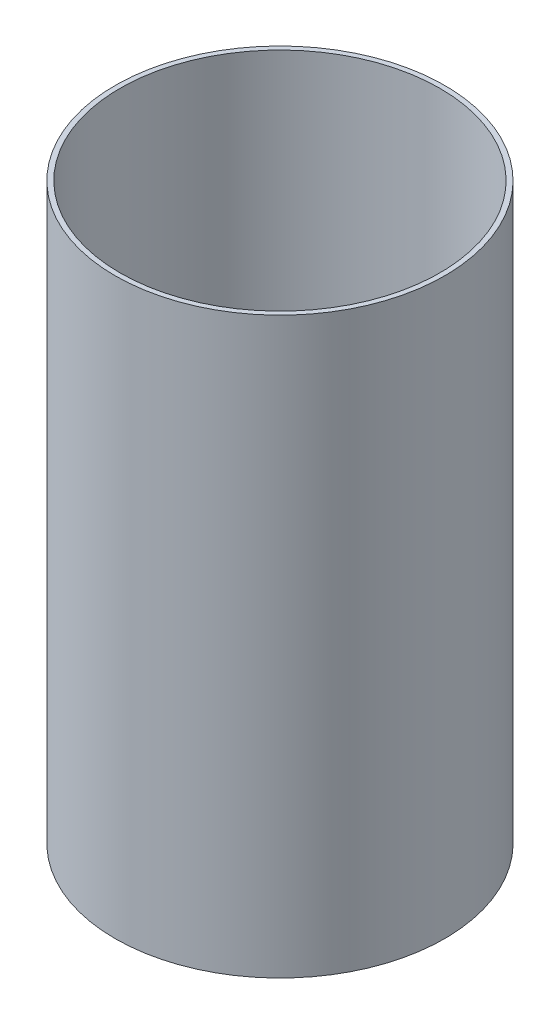
ISO-10303-21;
HEADER;
FILE_DESCRIPTION(('STEP AP214'),'2;1');
FILE_NAME('part.step','',(''),(''),'','','');
FILE_SCHEMA(('AUTOMOTIVE_DESIGN { 1 0 10303 214 1 1 1 1 }'));
ENDSEC;
DATA;
#1=APPLICATION_CONTEXT('core data for automotive mechanical design processes');
#2=APPLICATION_PROTOCOL_DEFINITION('international standard','automotive_design',2000,#1);
#3=PRODUCT_CONTEXT('',#1,'mechanical');
#4=PRODUCT('Part','Part','',(#3));
#5=PRODUCT_RELATED_PRODUCT_CATEGORY('part','',(#4));
#6=PRODUCT_DEFINITION_FORMATION('','',#4);
#7=PRODUCT_DEFINITION_CONTEXT('part definition',#1,'design');
#8=PRODUCT_DEFINITION('design','',#6,#7);
#9=PRODUCT_DEFINITION_SHAPE('','',#8);
#10=(LENGTH_UNIT() NAMED_UNIT(*) SI_UNIT(.MILLI.,.METRE.));
#11=(NAMED_UNIT(*) PLANE_ANGLE_UNIT() SI_UNIT($,.RADIAN.));
#12=(NAMED_UNIT(*) SI_UNIT($,.STERADIAN.) SOLID_ANGLE_UNIT());
#13=UNCERTAINTY_MEASURE_WITH_UNIT(LENGTH_MEASURE(1.E-05),#10,'distance_accuracy_value','');
#14=(GEOMETRIC_REPRESENTATION_CONTEXT(3) GLOBAL_UNCERTAINTY_ASSIGNED_CONTEXT((#13)) GLOBAL_UNIT_ASSIGNED_CONTEXT((#10,
#11,#12)) REPRESENTATION_CONTEXT('',''));
#15=CARTESIAN_POINT('',(0.,0.,0.));
#16=DIRECTION('',(0.,0.,1.));
#17=DIRECTION('',(1.,0.,0.));
#18=AXIS2_PLACEMENT_3D('',#15,#16,#17);
#19=CARTESIAN_POINT('',(0.,177.8,0.));
#20=DIRECTION('',(0.,-1.,0.));
#21=DIRECTION('',(0.,0.,-1.));
#22=AXIS2_PLACEMENT_3D('',#19,#20,#21);
#23=CYLINDRICAL_SURFACE('',#22,49.53);
#24=CARTESIAN_POINT('',(0.,177.8,0.));
#25=DIRECTION('',(0.,1.,0.));
#26=DIRECTION('',(0.,0.,1.));
#27=AXIS2_PLACEMENT_3D('',#24,#25,#26);
#28=CIRCLE('',#27,49.53);
#29=CARTESIAN_POINT('',(0.,177.8,49.53));
#30=VERTEX_POINT('',#29);
#31=EDGE_CURVE('E50',#30,#30,#28,.T.);
#32=ORIENTED_EDGE('',*,*,#31,.T.);
#33=EDGE_LOOP('',(#32));
#34=FACE_BOUND('',#33,.T.);
#35=CARTESIAN_POINT('',(0.,0.,0.));
#36=DIRECTION('',(0.,1.,0.));
#37=DIRECTION('',(0.,0.,1.));
#38=AXIS2_PLACEMENT_3D('',#35,#36,#37);
#39=CIRCLE('',#38,49.53);
#40=CARTESIAN_POINT('',(0.,0.,49.53));
#41=VERTEX_POINT('',#40);
#42=EDGE_CURVE('E52',#41,#41,#39,.T.);
#43=ORIENTED_EDGE('',*,*,#42,.F.);
#44=EDGE_LOOP('',(#43));
#45=FACE_BOUND('',#44,.T.);
#46=ADVANCED_FACE('F37',(#34,#45),#23,.F.);
#47=CARTESIAN_POINT('',(0.,177.8,0.));
#48=DIRECTION('',(0.,-1.,0.));
#49=DIRECTION('',(0.,0.,-1.));
#50=AXIS2_PLACEMENT_3D('',#47,#48,#49);
#51=CYLINDRICAL_SURFACE('',#50,51.054);
#52=CARTESIAN_POINT('',(0.,177.8,0.));
#53=DIRECTION('',(0.,1.,0.));
#54=DIRECTION('',(0.,0.,1.));
#55=AXIS2_PLACEMENT_3D('',#52,#53,#54);
#56=CIRCLE('',#55,51.054);
#57=CARTESIAN_POINT('',(0.,177.8,51.054));
#58=VERTEX_POINT('',#57);
#59=EDGE_CURVE('E10',#58,#58,#56,.T.);
#60=ORIENTED_EDGE('',*,*,#59,.F.);
#61=EDGE_LOOP('',(#60));
#62=FACE_BOUND('',#61,.T.);
#63=CARTESIAN_POINT('',(0.,0.,0.));
#64=DIRECTION('',(0.,1.,0.));
#65=DIRECTION('',(0.,0.,1.));
#66=AXIS2_PLACEMENT_3D('',#63,#64,#65);
#67=CIRCLE('',#66,51.054);
#68=CARTESIAN_POINT('',(0.,0.,51.054));
#69=VERTEX_POINT('',#68);
#70=EDGE_CURVE('E43',#69,#69,#67,.T.);
#71=ORIENTED_EDGE('',*,*,#70,.T.);
#72=EDGE_LOOP('',(#71));
#73=FACE_BOUND('',#72,.T.);
#74=ADVANCED_FACE('F58',(#62,#73),#51,.T.);
#75=CARTESIAN_POINT('',(0.,177.8,0.));
#76=DIRECTION('',(0.,1.,0.));
#77=DIRECTION('',(0.,0.,1.));
#78=AXIS2_PLACEMENT_3D('',#75,#76,#77);
#79=PLANE('',#78);
#80=ORIENTED_EDGE('',*,*,#31,.F.);
#81=EDGE_LOOP('',(#80));
#82=FACE_BOUND('',#81,.T.);
#83=ORIENTED_EDGE('',*,*,#59,.T.);
#84=EDGE_LOOP('',(#83));
#85=FACE_BOUND('',#84,.T.);
#86=ADVANCED_FACE('F61',(#82,#85),#79,.T.);
#87=CARTESIAN_POINT('',(0.,0.,0.));
#88=DIRECTION('',(0.,1.,0.));
#89=DIRECTION('',(0.,0.,1.));
#90=AXIS2_PLACEMENT_3D('',#87,#88,#89);
#91=PLANE('',#90);
#92=ORIENTED_EDGE('',*,*,#42,.T.);
#93=EDGE_LOOP('',(#92));
#94=FACE_BOUND('',#93,.T.);
#95=ORIENTED_EDGE('',*,*,#70,.F.);
#96=EDGE_LOOP('',(#95));
#97=FACE_BOUND('',#96,.T.);
#98=ADVANCED_FACE('F65',(#94,#97),#91,.F.);
#99=CLOSED_SHELL('',(#46,#74,#86,#98));
#100=MANIFOLD_SOLID_BREP('B2',#99);
#101=ADVANCED_BREP_SHAPE_REPRESENTATION('',(#18,#100),#14);
#102=SHAPE_DEFINITION_REPRESENTATION(#9,#101);
ENDSEC;
END-ISO-10303-21;
